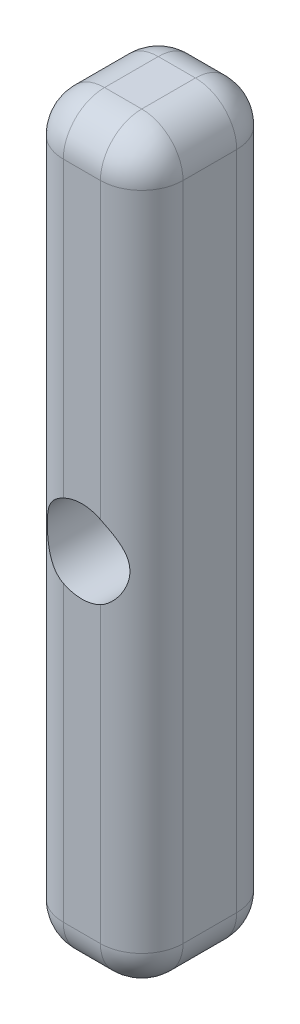
ISO-10303-21;
HEADER;
FILE_DESCRIPTION(('STEP AP214'),'2;1');
FILE_NAME('part.step','',(''),(''),'','','');
FILE_SCHEMA(('AUTOMOTIVE_DESIGN { 1 0 10303 214 1 1 1 1 }'));
ENDSEC;
DATA;
#1=APPLICATION_CONTEXT('core data for automotive mechanical design processes');
#2=APPLICATION_PROTOCOL_DEFINITION('international standard','automotive_design',2000,#1);
#3=PRODUCT_CONTEXT('',#1,'mechanical');
#4=PRODUCT('Part','Part','',(#3));
#5=PRODUCT_RELATED_PRODUCT_CATEGORY('part','',(#4));
#6=PRODUCT_DEFINITION_FORMATION('','',#4);
#7=PRODUCT_DEFINITION_CONTEXT('part definition',#1,'design');
#8=PRODUCT_DEFINITION('design','',#6,#7);
#9=PRODUCT_DEFINITION_SHAPE('','',#8);
#10=(LENGTH_UNIT() NAMED_UNIT(*) SI_UNIT(.MILLI.,.METRE.));
#11=(NAMED_UNIT(*) PLANE_ANGLE_UNIT() SI_UNIT($,.RADIAN.));
#12=(NAMED_UNIT(*) SI_UNIT($,.STERADIAN.) SOLID_ANGLE_UNIT());
#13=UNCERTAINTY_MEASURE_WITH_UNIT(LENGTH_MEASURE(1.E-05),#10,'distance_accuracy_value','');
#14=(GEOMETRIC_REPRESENTATION_CONTEXT(3) GLOBAL_UNCERTAINTY_ASSIGNED_CONTEXT((#13)) GLOBAL_UNIT_ASSIGNED_CONTEXT((#10,
#11,#12)) REPRESENTATION_CONTEXT('',''));
#15=CARTESIAN_POINT('',(0.,0.,0.));
#16=DIRECTION('',(0.,0.,1.));
#17=DIRECTION('',(1.,0.,0.));
#18=AXIS2_PLACEMENT_3D('',#15,#16,#17);
#19=CARTESIAN_POINT('',(0.,0.,16.5));
#20=DIRECTION('',(0.,0.,-1.));
#21=DIRECTION('',(-1.,0.,0.));
#22=AXIS2_PLACEMENT_3D('',#19,#20,#21);
#23=PLANE('',#22);
#24=DIRECTION('',(-1.,0.,0.));
#25=VECTOR('',#24,1.);
#26=CARTESIAN_POINT('',(0.,40.,16.5));
#27=LINE('',#26,#25);
#28=CARTESIAN_POINT('',(2.25,40.,16.5));
#29=VERTEX_POINT('',#28);
#30=CARTESIAN_POINT('',(-2.25,40.,16.5));
#31=VERTEX_POINT('',#30);
#32=EDGE_CURVE('E168',#29,#31,#27,.T.);
#33=ORIENTED_EDGE('',*,*,#32,.T.);
#34=DIRECTION('',(0.,-1.,0.));
#35=VECTOR('',#34,1.);
#36=CARTESIAN_POINT('',(-2.25,0.,16.5));
#37=LINE('',#36,#35);
#38=CARTESIAN_POINT('',(-2.25,4.46514277487294,16.5));
#39=VERTEX_POINT('',#38);
#40=EDGE_CURVE('E153',#31,#39,#37,.T.);
#41=ORIENTED_EDGE('',*,*,#40,.T.);
#42=CARTESIAN_POINT('',(0.,0.,16.5));
#43=DIRECTION('',(0.,0.,1.));
#44=DIRECTION('',(1.,0.,0.));
#45=AXIS2_PLACEMENT_3D('',#42,#43,#44);
#46=CIRCLE('',#45,5.);
#47=CARTESIAN_POINT('',(2.25,4.46514277487294,16.5));
#48=VERTEX_POINT('',#47);
#49=EDGE_CURVE('E144',#48,#39,#46,.T.);
#50=ORIENTED_EDGE('',*,*,#49,.F.);
#51=DIRECTION('',(0.,1.,0.));
#52=VECTOR('',#51,1.);
#53=CARTESIAN_POINT('',(2.25,0.,16.5));
#54=LINE('',#53,#52);
#55=EDGE_CURVE('E151',#48,#29,#54,.T.);
#56=ORIENTED_EDGE('',*,*,#55,.T.);
#57=EDGE_LOOP('',(#33,#41,#50,#56));
#58=FACE_BOUND('',#57,.T.);
#59=ADVANCED_FACE('F39',(#58),#23,.F.);
#60=CARTESIAN_POINT('',(7.25,45.,16.5));
#61=DIRECTION('',(0.,-1.,0.));
#62=DIRECTION('',(0.,0.,-1.));
#63=AXIS2_PLACEMENT_3D('',#60,#61,#62);
#64=PLANE('',#63);
#65=DIRECTION('',(-1.,0.,0.));
#66=VECTOR('',#65,1.);
#67=CARTESIAN_POINT('',(7.25,45.,11.5));
#68=LINE('',#67,#66);
#69=CARTESIAN_POINT('',(-2.25,45.,11.5));
#70=VERTEX_POINT('',#69);
#71=CARTESIAN_POINT('',(2.25,45.,11.5));
#72=VERTEX_POINT('',#71);
#73=EDGE_CURVE('E475',#70,#72,#68,.F.);
#74=ORIENTED_EDGE('',*,*,#73,.T.);
#75=DIRECTION('',(0.,0.,-1.));
#76=VECTOR('',#75,1.);
#77=CARTESIAN_POINT('',(2.25,45.,16.5));
#78=LINE('',#77,#76);
#79=CARTESIAN_POINT('',(2.25,45.,5.));
#80=VERTEX_POINT('',#79);
#81=EDGE_CURVE('E464',#72,#80,#78,.T.);
#82=ORIENTED_EDGE('',*,*,#81,.T.);
#83=DIRECTION('',(-1.,0.,0.));
#84=VECTOR('',#83,1.);
#85=CARTESIAN_POINT('',(-7.25,45.,5.));
#86=LINE('',#85,#84);
#87=CARTESIAN_POINT('',(-2.25,45.,5.));
#88=VERTEX_POINT('',#87);
#89=EDGE_CURVE('E469',#80,#88,#86,.T.);
#90=ORIENTED_EDGE('',*,*,#89,.T.);
#91=DIRECTION('',(0.,0.,-1.));
#92=VECTOR('',#91,1.);
#93=CARTESIAN_POINT('',(-2.25,45.,16.5));
#94=LINE('',#93,#92);
#95=EDGE_CURVE('E479',#88,#70,#94,.F.);
#96=ORIENTED_EDGE('',*,*,#95,.T.);
#97=EDGE_LOOP('',(#74,#82,#90,#96));
#98=FACE_BOUND('',#97,.T.);
#99=ADVANCED_FACE('F211',(#98),#64,.F.);
#100=CARTESIAN_POINT('',(-7.25,-45.,16.5));
#101=DIRECTION('',(1.,0.,0.));
#102=DIRECTION('',(0.,0.,-1.));
#103=AXIS2_PLACEMENT_3D('',#100,#101,#102);
#104=PLANE('',#103);
#105=DIRECTION('',(0.,0.,-1.));
#106=VECTOR('',#105,1.);
#107=CARTESIAN_POINT('',(-7.25,-40.,16.5));
#108=LINE('',#107,#106);
#109=CARTESIAN_POINT('',(-7.25,-40.,5.));
#110=VERTEX_POINT('',#109);
#111=CARTESIAN_POINT('',(-7.25,-40.,11.5));
#112=VERTEX_POINT('',#111);
#113=EDGE_CURVE('E581',#110,#112,#108,.F.);
#114=ORIENTED_EDGE('',*,*,#113,.T.);
#115=DIRECTION('',(0.,-1.,0.));
#116=VECTOR('',#115,1.);
#117=CARTESIAN_POINT('',(-7.25,-45.,11.5));
#118=LINE('',#117,#116);
#119=CARTESIAN_POINT('',(-7.25,40.,11.5));
#120=VERTEX_POINT('',#119);
#121=EDGE_CURVE('E565',#112,#120,#118,.F.);
#122=ORIENTED_EDGE('',*,*,#121,.T.);
#123=DIRECTION('',(0.,0.,-1.));
#124=VECTOR('',#123,1.);
#125=CARTESIAN_POINT('',(-7.25,40.,16.5));
#126=LINE('',#125,#124);
#127=CARTESIAN_POINT('',(-7.25,40.,5.));
#128=VERTEX_POINT('',#127);
#129=EDGE_CURVE('E564',#120,#128,#126,.T.);
#130=ORIENTED_EDGE('',*,*,#129,.T.);
#131=DIRECTION('',(0.,-1.,0.));
#132=VECTOR('',#131,1.);
#133=CARTESIAN_POINT('',(-7.25,-45.,5.));
#134=LINE('',#133,#132);
#135=EDGE_CURVE('E567',#128,#110,#134,.T.);
#136=ORIENTED_EDGE('',*,*,#135,.T.);
#137=EDGE_LOOP('',(#114,#122,#130,#136));
#138=FACE_BOUND('',#137,.T.);
#139=ADVANCED_FACE('F208',(#138),#104,.F.);
#140=CARTESIAN_POINT('',(7.25,-45.,16.5));
#141=DIRECTION('',(0.,1.,0.));
#142=DIRECTION('',(0.,0.,1.));
#143=AXIS2_PLACEMENT_3D('',#140,#141,#142);
#144=PLANE('',#143);
#145=DIRECTION('',(1.,0.,0.));
#146=VECTOR('',#145,1.);
#147=CARTESIAN_POINT('',(7.25,-45.,11.5));
#148=LINE('',#147,#146);
#149=CARTESIAN_POINT('',(2.25,-45.,11.5));
#150=VERTEX_POINT('',#149);
#151=CARTESIAN_POINT('',(-2.25,-45.,11.5));
#152=VERTEX_POINT('',#151);
#153=EDGE_CURVE('E48',#150,#152,#148,.F.);
#154=ORIENTED_EDGE('',*,*,#153,.T.);
#155=DIRECTION('',(0.,0.,-1.));
#156=VECTOR('',#155,1.);
#157=CARTESIAN_POINT('',(-2.25,-45.,16.5));
#158=LINE('',#157,#156);
#159=CARTESIAN_POINT('',(-2.25,-45.,5.));
#160=VERTEX_POINT('',#159);
#161=EDGE_CURVE('E11',#152,#160,#158,.T.);
#162=ORIENTED_EDGE('',*,*,#161,.T.);
#163=DIRECTION('',(1.,0.,0.));
#164=VECTOR('',#163,1.);
#165=CARTESIAN_POINT('',(7.25,-45.,5.));
#166=LINE('',#165,#164);
#167=CARTESIAN_POINT('',(2.25,-45.,5.));
#168=VERTEX_POINT('',#167);
#169=EDGE_CURVE('E487',#160,#168,#166,.T.);
#170=ORIENTED_EDGE('',*,*,#169,.T.);
#171=DIRECTION('',(0.,0.,-1.));
#172=VECTOR('',#171,1.);
#173=CARTESIAN_POINT('',(2.25,-45.,16.5));
#174=LINE('',#173,#172);
#175=EDGE_CURVE('E56',#168,#150,#174,.F.);
#176=ORIENTED_EDGE('',*,*,#175,.T.);
#177=EDGE_LOOP('',(#154,#162,#170,#176));
#178=FACE_BOUND('',#177,.T.);
#179=ADVANCED_FACE('F207',(#178),#144,.F.);
#180=CARTESIAN_POINT('',(7.25,-45.,16.5));
#181=DIRECTION('',(-1.,0.,0.));
#182=DIRECTION('',(0.,0.,1.));
#183=AXIS2_PLACEMENT_3D('',#180,#181,#182);
#184=PLANE('',#183);
#185=DIRECTION('',(0.,0.,-1.));
#186=VECTOR('',#185,1.);
#187=CARTESIAN_POINT('',(7.25,40.,16.5));
#188=LINE('',#187,#186);
#189=CARTESIAN_POINT('',(7.25,40.,5.));
#190=VERTEX_POINT('',#189);
#191=CARTESIAN_POINT('',(7.25,40.,11.5));
#192=VERTEX_POINT('',#191);
#193=EDGE_CURVE('E465',#190,#192,#188,.F.);
#194=ORIENTED_EDGE('',*,*,#193,.T.);
#195=DIRECTION('',(0.,1.,0.));
#196=VECTOR('',#195,1.);
#197=CARTESIAN_POINT('',(7.25,-45.,11.5));
#198=LINE('',#197,#196);
#199=CARTESIAN_POINT('',(7.25,-40.,11.5));
#200=VERTEX_POINT('',#199);
#201=EDGE_CURVE('E574',#192,#200,#198,.F.);
#202=ORIENTED_EDGE('',*,*,#201,.T.);
#203=DIRECTION('',(0.,0.,-1.));
#204=VECTOR('',#203,1.);
#205=CARTESIAN_POINT('',(7.25,-40.,16.5));
#206=LINE('',#205,#204);
#207=CARTESIAN_POINT('',(7.25,-40.,5.));
#208=VERTEX_POINT('',#207);
#209=EDGE_CURVE('E562',#200,#208,#206,.T.);
#210=ORIENTED_EDGE('',*,*,#209,.T.);
#211=DIRECTION('',(0.,1.,0.));
#212=VECTOR('',#211,1.);
#213=CARTESIAN_POINT('',(7.25,45.,5.));
#214=LINE('',#213,#212);
#215=EDGE_CURVE('E570',#208,#190,#214,.T.);
#216=ORIENTED_EDGE('',*,*,#215,.T.);
#217=EDGE_LOOP('',(#194,#202,#210,#216));
#218=FACE_BOUND('',#217,.T.);
#219=ADVANCED_FACE('F200',(#218),#184,.F.);
#220=CARTESIAN_POINT('',(-2.25,-4.46514277487294,16.5));
#221=VERTEX_POINT('',#220);
#222=CARTESIAN_POINT('',(2.25,-4.46514277487294,16.5));
#223=VERTEX_POINT('',#222);
#224=EDGE_CURVE('E148',#221,#223,#46,.T.);
#225=ORIENTED_EDGE('',*,*,#224,.F.);
#226=DIRECTION('',(0.,-1.,0.));
#227=VECTOR('',#226,1.);
#228=CARTESIAN_POINT('',(-2.25,0.,16.5));
#229=LINE('',#228,#227);
#230=CARTESIAN_POINT('',(-2.25,-40.,16.5));
#231=VERTEX_POINT('',#230);
#232=EDGE_CURVE('E169',#221,#231,#229,.T.);
#233=ORIENTED_EDGE('',*,*,#232,.T.);
#234=DIRECTION('',(1.,0.,0.));
#235=VECTOR('',#234,1.);
#236=CARTESIAN_POINT('',(0.,-40.,16.5));
#237=LINE('',#236,#235);
#238=CARTESIAN_POINT('',(2.25,-40.,16.5));
#239=VERTEX_POINT('',#238);
#240=EDGE_CURVE('E553',#231,#239,#237,.T.);
#241=ORIENTED_EDGE('',*,*,#240,.T.);
#242=DIRECTION('',(0.,1.,0.));
#243=VECTOR('',#242,1.);
#244=CARTESIAN_POINT('',(2.25,0.,16.5));
#245=LINE('',#244,#243);
#246=EDGE_CURVE('E551',#239,#223,#245,.T.);
#247=ORIENTED_EDGE('',*,*,#246,.T.);
#248=EDGE_LOOP('',(#225,#233,#241,#247));
#249=FACE_BOUND('',#248,.T.);
#250=ADVANCED_FACE('F192',(#249),#23,.F.);
#251=CARTESIAN_POINT('',(0.,0.,0.));
#252=DIRECTION('',(0.,0.,-1.));
#253=DIRECTION('',(-1.,0.,0.));
#254=AXIS2_PLACEMENT_3D('',#251,#252,#253);
#255=PLANE('',#254);
#256=DIRECTION('',(0.,-1.,0.));
#257=VECTOR('',#256,1.);
#258=CARTESIAN_POINT('',(-2.25,45.,0.));
#259=LINE('',#258,#257);
#260=CARTESIAN_POINT('',(-2.25,-40.,0.));
#261=VERTEX_POINT('',#260);
#262=CARTESIAN_POINT('',(-2.25,40.,0.));
#263=VERTEX_POINT('',#262);
#264=EDGE_CURVE('E481',#261,#263,#259,.F.);
#265=ORIENTED_EDGE('',*,*,#264,.T.);
#266=DIRECTION('',(-1.,0.,0.));
#267=VECTOR('',#266,1.);
#268=CARTESIAN_POINT('',(7.25,40.,0.));
#269=LINE('',#268,#267);
#270=CARTESIAN_POINT('',(2.25,40.,0.));
#271=VERTEX_POINT('',#270);
#272=EDGE_CURVE('E482',#263,#271,#269,.F.);
#273=ORIENTED_EDGE('',*,*,#272,.T.);
#274=DIRECTION('',(0.,1.,0.));
#275=VECTOR('',#274,1.);
#276=CARTESIAN_POINT('',(2.25,-45.,0.));
#277=LINE('',#276,#275);
#278=CARTESIAN_POINT('',(2.25,-40.,0.));
#279=VERTEX_POINT('',#278);
#280=EDGE_CURVE('E472',#271,#279,#277,.F.);
#281=ORIENTED_EDGE('',*,*,#280,.T.);
#282=DIRECTION('',(1.,0.,0.));
#283=VECTOR('',#282,1.);
#284=CARTESIAN_POINT('',(-7.25,-40.,0.));
#285=LINE('',#284,#283);
#286=EDGE_CURVE('E471',#279,#261,#285,.F.);
#287=ORIENTED_EDGE('',*,*,#286,.T.);
#288=EDGE_LOOP('',(#265,#273,#281,#287));
#289=FACE_BOUND('',#288,.T.);
#290=ADVANCED_FACE('F191',(#289),#255,.T.);
#291=CARTESIAN_POINT('',(0.,0.,3.5));
#292=DIRECTION('',(0.,0.,1.));
#293=DIRECTION('',(1.,0.,0.));
#294=AXIS2_PLACEMENT_3D('',#291,#292,#293);
#295=CYLINDRICAL_SURFACE('',#294,5.);
#296=CARTESIAN_POINT('',(0.,0.,3.5));
#297=DIRECTION('',(0.,0.,1.));
#298=DIRECTION('',(1.,0.,0.));
#299=AXIS2_PLACEMENT_3D('',#296,#297,#298);
#300=CIRCLE('',#299,5.);
#301=CARTESIAN_POINT('',(5.,0.,3.5));
#302=VERTEX_POINT('',#301);
#303=EDGE_CURVE('E160',#302,#302,#300,.T.);
#304=ORIENTED_EDGE('',*,*,#303,.F.);
#305=EDGE_LOOP('',(#304));
#306=FACE_BOUND('',#305,.T.);
#307=ORIENTED_EDGE('',*,*,#49,.T.);
#308=CARTESIAN_POINT('',(-2.25,4.46514277487294,16.5));
#309=CARTESIAN_POINT('',(-2.36763941872739,4.40589367413245,16.5000177384845));
#310=CARTESIAN_POINT('',(-2.48283993615807,4.34198705837842,16.4958498174685));
#311=CARTESIAN_POINT('',(-2.70735869866159,4.20563473719382,16.4803030490482));
#312=CARTESIAN_POINT('',(-2.81668476345617,4.13320081461912,16.4689340588938));
#313=CARTESIAN_POINT('',(-3.02798431943095,3.98097468015155,16.4402468084663));
#314=CARTESIAN_POINT('',(-3.13000661626239,3.90124145061437,16.4229736048319));
#315=CARTESIAN_POINT('',(-3.32704485390078,3.73462695600149,16.3836542331769));
#316=CARTESIAN_POINT('',(-3.42205843548182,3.64774330463296,16.3616064677161));
#317=CARTESIAN_POINT('',(-3.6950124252242,3.37816117935055,16.2903152817992));
#318=CARTESIAN_POINT('',(-3.86210456571715,3.18563252763685,16.2357295082399));
#319=CARTESIAN_POINT('',(-4.08903804569647,2.88027135370775,16.1502188448062));
#320=CARTESIAN_POINT('',(-4.16083895642888,2.77552039277155,16.1210544515042));
#321=CARTESIAN_POINT('',(-4.29628103992035,2.56087552295242,16.0626921332652));
#322=CARTESIAN_POINT('',(-4.35992131544122,2.45098105036531,16.0334942049966));
#323=CARTESIAN_POINT('',(-4.55236536052825,2.0872694917997,15.9408263310664));
#324=CARTESIAN_POINT('',(-4.66443206981224,1.82352723195792,15.8796248246105));
#325=CARTESIAN_POINT('',(-4.79787710889541,1.41455787708638,15.8024349260961));
#326=CARTESIAN_POINT('',(-4.83657259869927,1.27607897447896,15.7791480905268));
#327=CARTESIAN_POINT('',(-4.90203575830977,0.995375907910255,15.7388905619299));
#328=CARTESIAN_POINT('',(-4.92880546050864,0.853152386485573,15.7219187927703));
#329=CARTESIAN_POINT('',(-4.96855755755883,0.575938178987913,15.6964227982793));
#330=CARTESIAN_POINT('',(-4.98234959766289,0.441108426799793,15.6874051034966));
#331=CARTESIAN_POINT('',(-4.998930737032,0.17048202507457,15.6765392953172));
#332=CARTESIAN_POINT('',(-5.00172042267079,0.0346854274522222,15.6746907998359));
#333=CARTESIAN_POINT('',(-4.99624144962365,-0.23657252902098,15.6782976025404));
#334=CARTESIAN_POINT('',(-4.98797421103391,-0.372033928684486,15.683751962784));
#335=CARTESIAN_POINT('',(-4.96054611918783,-0.641348150377429,15.7015701078942));
#336=CARTESIAN_POINT('',(-4.94138550477139,-0.775201007608845,15.7139337412732));
#337=CARTESIAN_POINT('',(-4.87406631182834,-1.13975209695276,15.7563973897545));
#338=CARTESIAN_POINT('',(-4.81493706648146,-1.36777602929481,15.7928450217821));
#339=CARTESIAN_POINT('',(-4.66631741485742,-1.81118825752496,15.8782047193024));
#340=CARTESIAN_POINT('',(-4.57679342322397,-2.02656226546175,15.9271305579259));
#341=CARTESIAN_POINT('',(-4.35520888133217,-2.47013683538152,16.0371091090358));
#342=CARTESIAN_POINT('',(-4.2190276231344,-2.69611936201107,16.0989066796638));
#343=CARTESIAN_POINT('',(-3.98927039210632,-3.01712430406534,16.1884647765408));
#344=CARTESIAN_POINT('',(-3.90847454552075,-3.12109309607515,16.2177833175709));
#345=CARTESIAN_POINT('',(-3.73856037456244,-3.32273006485733,16.2741169775141));
#346=CARTESIAN_POINT('',(-3.64944154929259,-3.42039786182164,16.3011319576059));
#347=CARTESIAN_POINT('',(-3.46260841511011,-3.60944894133504,16.3517015841764));
#348=CARTESIAN_POINT('',(-3.36484125740312,-3.70078649104852,16.3752322153626));
#349=CARTESIAN_POINT('',(-3.16169099966968,-3.87578111559663,16.4172734402199));
#350=CARTESIAN_POINT('',(-3.05631064514129,-3.95944093473587,16.435785832254));
#351=CARTESIAN_POINT('',(-2.83777883657689,-4.11890726055911,16.4665631196433));
#352=CARTESIAN_POINT('',(-2.72458057950156,-4.19465814486983,16.4787858691114));
#353=CARTESIAN_POINT('',(-2.49180690105894,-4.33700652022862,16.4955205831415));
#354=CARTESIAN_POINT('',(-2.37222214485026,-4.40359007377898,16.5000209234937));
#355=CARTESIAN_POINT('',(-2.25,-4.46514277487294,16.5));
#356=B_SPLINE_CURVE_WITH_KNOTS('',3,(#308,#309,#310,#311,#312,#313,#314,#315,#316,#317,#318,
#319,#320,#321,#322,#323,#324,#325,#326,#327,#328,#329,#330,#331,#332,#333,#334,#335,#336,#337,
#338,#339,#340,#341,#342,#343,#344,#345,#346,#347,#348,#349,#350,#351,#352,#353,#354,#355),
.UNSPECIFIED.,.F.,.F.,(4,2,2,2,2,2,2,2,2,2,2,2,2,2,2,2,2,2,2,2,2,2,2,4),(0.,0.394860119699031,
0.789180896162676,1.18055730848954,1.57206486771689,2.35050524654637,2.74112706009149,
3.13179178461606,4.0055560167331,4.4420160827286,4.87840173873699,5.28528968182163,
5.69215593939967,6.0989699461234,6.50577503369584,7.21774693604771,7.93050812203701,
8.73987525162162,9.14423505054802,9.5486192005323,9.95567231961067,10.3625793715252,
10.7721786542793,11.1823939501022),.UNSPECIFIED.);
#357=EDGE_CURVE('E147',#39,#221,#356,.T.);
#358=ORIENTED_EDGE('',*,*,#357,.T.);
#359=ORIENTED_EDGE('',*,*,#224,.T.);
#360=CARTESIAN_POINT('',(2.25,-4.46514277487294,16.5));
#361=CARTESIAN_POINT('',(2.36763941872738,-4.40589367413245,16.5000177384845));
#362=CARTESIAN_POINT('',(2.48283993615807,-4.34198705837842,16.4958498174685));
#363=CARTESIAN_POINT('',(2.70735869866159,-4.20563473719382,16.4803030490482));
#364=CARTESIAN_POINT('',(2.81668476345617,-4.13320081461912,16.4689340588938));
#365=CARTESIAN_POINT('',(3.02798431943095,-3.98097468015155,16.4402468084663));
#366=CARTESIAN_POINT('',(3.13000661626239,-3.90124145061437,16.4229736048319));
#367=CARTESIAN_POINT('',(3.32704485390078,-3.73462695600149,16.3836542331769));
#368=CARTESIAN_POINT('',(3.42205843548181,-3.64774330463296,16.3616064677161));
#369=CARTESIAN_POINT('',(3.6950124252242,-3.37816117935055,16.2903152817992));
#370=CARTESIAN_POINT('',(3.86210456571715,-3.18563252763685,16.2357295082398));
#371=CARTESIAN_POINT('',(4.08903804569647,-2.88027135370775,16.1502188448062));
#372=CARTESIAN_POINT('',(4.16083895642888,-2.77552039277155,16.1210544515042));
#373=CARTESIAN_POINT('',(4.29628103992035,-2.56087552295242,16.0626921332652));
#374=CARTESIAN_POINT('',(4.35992131544122,-2.45098105036531,16.0334942049966));
#375=CARTESIAN_POINT('',(4.55236536052825,-2.0872694917997,15.9408263310664));
#376=CARTESIAN_POINT('',(4.66443206981224,-1.82352723195792,15.8796248246105));
#377=CARTESIAN_POINT('',(4.79787710889541,-1.41455787708638,15.8024349260961));
#378=CARTESIAN_POINT('',(4.83657259869927,-1.27607897447896,15.7791480905268));
#379=CARTESIAN_POINT('',(4.90203575830977,-0.995375907910258,15.7388905619299));
#380=CARTESIAN_POINT('',(4.92880546050864,-0.853152386485577,15.7219187927703));
#381=CARTESIAN_POINT('',(4.96855755755883,-0.575938178987916,15.6964227982793));
#382=CARTESIAN_POINT('',(4.98234959766289,-0.441108426799797,15.6874051034966));
#383=CARTESIAN_POINT('',(4.998930737032,-0.170482025074573,15.6765392953172));
#384=CARTESIAN_POINT('',(5.00172042267079,-0.0346854274522255,15.6746907998359));
#385=CARTESIAN_POINT('',(4.99624144962365,0.236572529020977,15.6782976025404));
#386=CARTESIAN_POINT('',(4.98797421103391,0.372033928684484,15.683751962784));
#387=CARTESIAN_POINT('',(4.96054611918783,0.641348150377426,15.7015701078942));
#388=CARTESIAN_POINT('',(4.94138550477139,0.775201007608842,15.7139337412732));
#389=CARTESIAN_POINT('',(4.87406631182834,1.13975209695276,15.7563973897545));
#390=CARTESIAN_POINT('',(4.81493706648146,1.36777602929481,15.7928450217821));
#391=CARTESIAN_POINT('',(4.66631741485743,1.81118825752496,15.8782047193024));
#392=CARTESIAN_POINT('',(4.57679342322397,2.02656226546175,15.9271305579259));
#393=CARTESIAN_POINT('',(4.35520888133217,2.47013683538151,16.0371091090358));
#394=CARTESIAN_POINT('',(4.2190276231344,2.69611936201107,16.0989066796638));
#395=CARTESIAN_POINT('',(3.98927039210632,3.01712430406534,16.1884647765408));
#396=CARTESIAN_POINT('',(3.90847454552075,3.12109309607515,16.2177833175709));
#397=CARTESIAN_POINT('',(3.73856037456244,3.32273006485733,16.2741169775141));
#398=CARTESIAN_POINT('',(3.64944154929259,3.42039786182164,16.3011319576059));
#399=CARTESIAN_POINT('',(3.46260841511012,3.60944894133504,16.3517015841764));
#400=CARTESIAN_POINT('',(3.36484125740312,3.70078649104852,16.3752322153626));
#401=CARTESIAN_POINT('',(3.16169099966969,3.87578111559663,16.4172734402199));
#402=CARTESIAN_POINT('',(3.05631064514129,3.95944093473586,16.435785832254));
#403=CARTESIAN_POINT('',(2.83777883657689,4.11890726055911,16.4665631196433));
#404=CARTESIAN_POINT('',(2.72458057950156,4.19465814486983,16.4787858691114));
#405=CARTESIAN_POINT('',(2.49180690105894,4.33700652022862,16.4955205831415));
#406=CARTESIAN_POINT('',(2.37222214485026,4.40359007377898,16.5000209234937));
#407=CARTESIAN_POINT('',(2.25,4.46514277487294,16.5));
#408=B_SPLINE_CURVE_WITH_KNOTS('',3,(#360,#361,#362,#363,#364,#365,#366,#367,#368,#369,#370,
#371,#372,#373,#374,#375,#376,#377,#378,#379,#380,#381,#382,#383,#384,#385,#386,#387,#388,#389,
#390,#391,#392,#393,#394,#395,#396,#397,#398,#399,#400,#401,#402,#403,#404,#405,#406,#407),
.UNSPECIFIED.,.F.,.F.,(4,2,2,2,2,2,2,2,2,2,2,2,2,2,2,2,2,2,2,2,2,2,2,4),(0.,0.394860119699031,
0.789180896162676,1.18055730848954,1.57206486771689,2.35050524654637,2.74112706009149,
3.13179178461606,4.0055560167331,4.4420160827286,4.87840173873699,5.28528968182163,
5.69215593939966,6.0989699461234,6.50577503369584,7.21774693604771,7.93050812203701,
8.73987525162162,9.14423505054802,9.5486192005323,9.95567231961067,10.3625793715252,
10.7721786542793,11.1823939501022),.UNSPECIFIED.);
#409=EDGE_CURVE('E142',#223,#48,#408,.T.);
#410=ORIENTED_EDGE('',*,*,#409,.T.);
#411=EDGE_LOOP('',(#307,#358,#359,#410));
#412=FACE_BOUND('',#411,.T.);
#413=ADVANCED_FACE('F141',(#306,#412),#295,.F.);
#414=CARTESIAN_POINT('',(0.,0.,3.5));
#415=DIRECTION('',(0.,0.,1.));
#416=DIRECTION('',(1.,0.,0.));
#417=AXIS2_PLACEMENT_3D('',#414,#415,#416);
#418=PLANE('',#417);
#419=ORIENTED_EDGE('',*,*,#303,.T.);
#420=EDGE_LOOP('',(#419));
#421=FACE_BOUND('',#420,.T.);
#422=ADVANCED_FACE('F195',(#421),#418,.T.);
#423=CARTESIAN_POINT('',(2.25,-45.,5.));
#424=DIRECTION('',(0.,-1.,0.));
#425=DIRECTION('',(0.,0.,-1.));
#426=AXIS2_PLACEMENT_3D('',#423,#424,#425);
#427=CYLINDRICAL_SURFACE('',#426,5.);
#428=CARTESIAN_POINT('',(2.25,40.,5.));
#429=DIRECTION('',(0.,1.,0.));
#430=DIRECTION('',(0.,0.,1.));
#431=AXIS2_PLACEMENT_3D('',#428,#429,#430);
#432=CIRCLE('',#431,5.);
#433=EDGE_CURVE('E43',#190,#271,#432,.T.);
#434=ORIENTED_EDGE('',*,*,#433,.F.);
#435=ORIENTED_EDGE('',*,*,#215,.F.);
#436=CARTESIAN_POINT('',(2.25,-40.,5.));
#437=DIRECTION('',(0.,-1.,0.));
#438=DIRECTION('',(0.,0.,-1.));
#439=AXIS2_PLACEMENT_3D('',#436,#437,#438);
#440=CIRCLE('',#439,5.);
#441=EDGE_CURVE('E542',#279,#208,#440,.T.);
#442=ORIENTED_EDGE('',*,*,#441,.F.);
#443=ORIENTED_EDGE('',*,*,#280,.F.);
#444=EDGE_LOOP('',(#434,#435,#442,#443));
#445=FACE_BOUND('',#444,.T.);
#446=ADVANCED_FACE('F41',(#445),#427,.T.);
#447=CARTESIAN_POINT('',(2.25,40.,5.));
#448=DIRECTION('',(0.,0.,-1.));
#449=DIRECTION('',(-1.,0.,0.));
#450=AXIS2_PLACEMENT_3D('',#447,#448,#449);
#451=SPHERICAL_SURFACE('',#450,5.);
#452=CARTESIAN_POINT('',(2.25,40.,5.));
#453=DIRECTION('',(0.,0.,-1.));
#454=DIRECTION('',(-1.,0.,0.));
#455=AXIS2_PLACEMENT_3D('',#452,#453,#454);
#456=CIRCLE('',#455,5.);
#457=EDGE_CURVE('E457',#190,#80,#456,.F.);
#458=ORIENTED_EDGE('',*,*,#457,.F.);
#459=ORIENTED_EDGE('',*,*,#433,.T.);
#460=CARTESIAN_POINT('',(2.25,40.,5.));
#461=DIRECTION('',(1.,0.,0.));
#462=DIRECTION('',(0.,0.,-1.));
#463=AXIS2_PLACEMENT_3D('',#460,#461,#462);
#464=CIRCLE('',#463,5.);
#465=EDGE_CURVE('E467',#80,#271,#464,.F.);
#466=ORIENTED_EDGE('',*,*,#465,.F.);
#467=EDGE_LOOP('',(#458,#459,#466));
#468=FACE_BOUND('',#467,.T.);
#469=ADVANCED_FACE('F328',(#468),#451,.T.);
#470=CARTESIAN_POINT('',(2.25,-40.,5.));
#471=DIRECTION('',(1.,0.,0.));
#472=DIRECTION('',(0.,0.,-1.));
#473=AXIS2_PLACEMENT_3D('',#470,#471,#472);
#474=SPHERICAL_SURFACE('',#473,5.);
#475=CARTESIAN_POINT('',(2.25,-40.,5.));
#476=DIRECTION('',(1.,0.,0.));
#477=DIRECTION('',(0.,0.,-1.));
#478=AXIS2_PLACEMENT_3D('',#475,#476,#477);
#479=CIRCLE('',#478,5.);
#480=EDGE_CURVE('E536',#279,#168,#479,.F.);
#481=ORIENTED_EDGE('',*,*,#480,.F.);
#482=ORIENTED_EDGE('',*,*,#441,.T.);
#483=CARTESIAN_POINT('',(2.25,-40.,5.));
#484=DIRECTION('',(0.,0.,-1.));
#485=DIRECTION('',(-1.,0.,0.));
#486=AXIS2_PLACEMENT_3D('',#483,#484,#485);
#487=CIRCLE('',#486,5.);
#488=EDGE_CURVE('E470',#168,#208,#487,.F.);
#489=ORIENTED_EDGE('',*,*,#488,.F.);
#490=EDGE_LOOP('',(#481,#482,#489));
#491=FACE_BOUND('',#490,.T.);
#492=ADVANCED_FACE('F335',(#491),#474,.T.);
#493=CARTESIAN_POINT('',(7.25,40.,5.));
#494=DIRECTION('',(1.,0.,0.));
#495=DIRECTION('',(0.,0.,-1.));
#496=AXIS2_PLACEMENT_3D('',#493,#494,#495);
#497=CYLINDRICAL_SURFACE('',#496,5.);
#498=ORIENTED_EDGE('',*,*,#465,.T.);
#499=ORIENTED_EDGE('',*,*,#272,.F.);
#500=CARTESIAN_POINT('',(-2.25,40.,5.));
#501=DIRECTION('',(-1.,0.,0.));
#502=DIRECTION('',(0.,0.,1.));
#503=AXIS2_PLACEMENT_3D('',#500,#501,#502);
#504=CIRCLE('',#503,5.);
#505=EDGE_CURVE('E531',#88,#263,#504,.T.);
#506=ORIENTED_EDGE('',*,*,#505,.F.);
#507=ORIENTED_EDGE('',*,*,#89,.F.);
#508=EDGE_LOOP('',(#498,#499,#506,#507));
#509=FACE_BOUND('',#508,.T.);
#510=ADVANCED_FACE('F343',(#509),#497,.T.);
#511=CARTESIAN_POINT('',(2.25,40.,16.5));
#512=DIRECTION('',(0.,0.,-1.));
#513=DIRECTION('',(-1.,0.,0.));
#514=AXIS2_PLACEMENT_3D('',#511,#512,#513);
#515=CYLINDRICAL_SURFACE('',#514,5.);
#516=ORIENTED_EDGE('',*,*,#457,.T.);
#517=ORIENTED_EDGE('',*,*,#81,.F.);
#518=CARTESIAN_POINT('',(2.25,40.,11.5));
#519=DIRECTION('',(0.,0.,1.));
#520=DIRECTION('',(1.,0.,0.));
#521=AXIS2_PLACEMENT_3D('',#518,#519,#520);
#522=CIRCLE('',#521,5.);
#523=EDGE_CURVE('E532',#192,#72,#522,.T.);
#524=ORIENTED_EDGE('',*,*,#523,.F.);
#525=ORIENTED_EDGE('',*,*,#193,.F.);
#526=EDGE_LOOP('',(#516,#517,#524,#525));
#527=FACE_BOUND('',#526,.T.);
#528=ADVANCED_FACE('F273',(#527),#515,.T.);
#529=CARTESIAN_POINT('',(2.25,0.,11.5));
#530=DIRECTION('',(0.,1.,0.));
#531=DIRECTION('',(0.,0.,1.));
#532=AXIS2_PLACEMENT_3D('',#529,#530,#531);
#533=CYLINDRICAL_SURFACE('',#532,5.);
#534=CARTESIAN_POINT('',(2.25,-40.,11.5));
#535=DIRECTION('',(0.,-1.,0.));
#536=DIRECTION('',(0.,0.,-1.));
#537=AXIS2_PLACEMENT_3D('',#534,#535,#536);
#538=CIRCLE('',#537,5.);
#539=EDGE_CURVE('E526',#200,#239,#538,.T.);
#540=ORIENTED_EDGE('',*,*,#539,.F.);
#541=ORIENTED_EDGE('',*,*,#201,.F.);
#542=CARTESIAN_POINT('',(2.25,40.,11.5));
#543=DIRECTION('',(0.,1.,0.));
#544=DIRECTION('',(0.,0.,1.));
#545=AXIS2_PLACEMENT_3D('',#542,#543,#544);
#546=CIRCLE('',#545,5.);
#547=EDGE_CURVE('E165',#29,#192,#546,.T.);
#548=ORIENTED_EDGE('',*,*,#547,.F.);
#549=ORIENTED_EDGE('',*,*,#55,.F.);
#550=ORIENTED_EDGE('',*,*,#409,.F.);
#551=ORIENTED_EDGE('',*,*,#246,.F.);
#552=EDGE_LOOP('',(#540,#541,#548,#549,#550,#551));
#553=FACE_BOUND('',#552,.T.);
#554=ADVANCED_FACE('F163',(#553),#533,.T.);
#555=CARTESIAN_POINT('',(2.25,-40.,16.5));
#556=DIRECTION('',(0.,0.,-1.));
#557=DIRECTION('',(-1.,0.,0.));
#558=AXIS2_PLACEMENT_3D('',#555,#556,#557);
#559=CYLINDRICAL_SURFACE('',#558,5.);
#560=ORIENTED_EDGE('',*,*,#488,.T.);
#561=ORIENTED_EDGE('',*,*,#209,.F.);
#562=CARTESIAN_POINT('',(2.25,-40.,11.5));
#563=DIRECTION('',(0.,0.,1.));
#564=DIRECTION('',(1.,0.,0.));
#565=AXIS2_PLACEMENT_3D('',#562,#563,#564);
#566=CIRCLE('',#565,5.);
#567=EDGE_CURVE('E521',#150,#200,#566,.T.);
#568=ORIENTED_EDGE('',*,*,#567,.F.);
#569=ORIENTED_EDGE('',*,*,#175,.F.);
#570=EDGE_LOOP('',(#560,#561,#568,#569));
#571=FACE_BOUND('',#570,.T.);
#572=ADVANCED_FACE('F270',(#571),#559,.T.);
#573=CARTESIAN_POINT('',(7.25,-40.,5.));
#574=DIRECTION('',(-1.,0.,0.));
#575=DIRECTION('',(0.,0.,1.));
#576=AXIS2_PLACEMENT_3D('',#573,#574,#575);
#577=CYLINDRICAL_SURFACE('',#576,5.);
#578=ORIENTED_EDGE('',*,*,#480,.T.);
#579=ORIENTED_EDGE('',*,*,#169,.F.);
#580=CARTESIAN_POINT('',(-2.25,-40.,5.));
#581=DIRECTION('',(-1.,0.,0.));
#582=DIRECTION('',(0.,-1.,0.));
#583=AXIS2_PLACEMENT_3D('',#580,#581,#582);
#584=CIRCLE('',#583,5.);
#585=EDGE_CURVE('E524',#261,#160,#584,.T.);
#586=ORIENTED_EDGE('',*,*,#585,.F.);
#587=ORIENTED_EDGE('',*,*,#286,.F.);
#588=EDGE_LOOP('',(#578,#579,#586,#587));
#589=FACE_BOUND('',#588,.T.);
#590=ADVANCED_FACE('F261',(#589),#577,.T.);
#591=CARTESIAN_POINT('',(-2.25,-45.,5.));
#592=DIRECTION('',(0.,1.,0.));
#593=DIRECTION('',(0.,0.,1.));
#594=AXIS2_PLACEMENT_3D('',#591,#592,#593);
#595=CYLINDRICAL_SURFACE('',#594,5.);
#596=CARTESIAN_POINT('',(-2.25,40.,5.));
#597=DIRECTION('',(0.,1.,0.));
#598=DIRECTION('',(-1.,0.,0.));
#599=AXIS2_PLACEMENT_3D('',#596,#597,#598);
#600=CIRCLE('',#599,5.);
#601=EDGE_CURVE('E533',#263,#128,#600,.T.);
#602=ORIENTED_EDGE('',*,*,#601,.F.);
#603=ORIENTED_EDGE('',*,*,#264,.F.);
#604=CARTESIAN_POINT('',(-2.25,-40.,5.));
#605=DIRECTION('',(0.,-1.,0.));
#606=DIRECTION('',(0.,0.,-1.));
#607=AXIS2_PLACEMENT_3D('',#604,#605,#606);
#608=CIRCLE('',#607,5.);
#609=EDGE_CURVE('E519',#110,#261,#608,.T.);
#610=ORIENTED_EDGE('',*,*,#609,.F.);
#611=ORIENTED_EDGE('',*,*,#135,.F.);
#612=EDGE_LOOP('',(#602,#603,#610,#611));
#613=FACE_BOUND('',#612,.T.);
#614=ADVANCED_FACE('F263',(#613),#595,.T.);
#615=CARTESIAN_POINT('',(-2.25,40.,5.));
#616=DIRECTION('',(0.,0.,-1.));
#617=DIRECTION('',(-1.,0.,0.));
#618=AXIS2_PLACEMENT_3D('',#615,#616,#617);
#619=SPHERICAL_SURFACE('',#618,5.);
#620=ORIENTED_EDGE('',*,*,#505,.T.);
#621=ORIENTED_EDGE('',*,*,#601,.T.);
#622=CARTESIAN_POINT('',(-2.25,40.,5.));
#623=DIRECTION('',(0.,0.,-1.));
#624=DIRECTION('',(-1.,0.,0.));
#625=AXIS2_PLACEMENT_3D('',#622,#623,#624);
#626=CIRCLE('',#625,5.);
#627=EDGE_CURVE('E518',#88,#128,#626,.F.);
#628=ORIENTED_EDGE('',*,*,#627,.F.);
#629=EDGE_LOOP('',(#620,#621,#628));
#630=FACE_BOUND('',#629,.T.);
#631=ADVANCED_FACE('F260',(#630),#619,.T.);
#632=CARTESIAN_POINT('',(2.25,40.,11.5));
#633=DIRECTION('',(1.,0.,0.));
#634=DIRECTION('',(0.,0.,-1.));
#635=AXIS2_PLACEMENT_3D('',#632,#633,#634);
#636=SPHERICAL_SURFACE('',#635,5.);
#637=ORIENTED_EDGE('',*,*,#547,.T.);
#638=ORIENTED_EDGE('',*,*,#523,.T.);
#639=CARTESIAN_POINT('',(2.25,40.,11.5));
#640=DIRECTION('',(1.,0.,0.));
#641=DIRECTION('',(0.,0.,-1.));
#642=AXIS2_PLACEMENT_3D('',#639,#640,#641);
#643=CIRCLE('',#642,5.);
#644=EDGE_CURVE('E514',#29,#72,#643,.F.);
#645=ORIENTED_EDGE('',*,*,#644,.F.);
#646=EDGE_LOOP('',(#637,#638,#645));
#647=FACE_BOUND('',#646,.T.);
#648=ADVANCED_FACE('F254',(#647),#636,.T.);
#649=CARTESIAN_POINT('',(2.25,-40.,11.5));
#650=DIRECTION('',(1.,0.,0.));
#651=DIRECTION('',(0.,0.,-1.));
#652=AXIS2_PLACEMENT_3D('',#649,#650,#651);
#653=SPHERICAL_SURFACE('',#652,5.);
#654=ORIENTED_EDGE('',*,*,#567,.T.);
#655=ORIENTED_EDGE('',*,*,#539,.T.);
#656=CARTESIAN_POINT('',(2.25,-40.,11.5));
#657=DIRECTION('',(1.,0.,0.));
#658=DIRECTION('',(0.,0.,-1.));
#659=AXIS2_PLACEMENT_3D('',#656,#657,#658);
#660=CIRCLE('',#659,5.);
#661=EDGE_CURVE('E509',#150,#239,#660,.F.);
#662=ORIENTED_EDGE('',*,*,#661,.F.);
#663=EDGE_LOOP('',(#654,#655,#662));
#664=FACE_BOUND('',#663,.T.);
#665=ADVANCED_FACE('F248',(#664),#653,.T.);
#666=CARTESIAN_POINT('',(-2.25,-40.,5.));
#667=DIRECTION('',(0.,0.,-1.));
#668=DIRECTION('',(-1.,0.,0.));
#669=AXIS2_PLACEMENT_3D('',#666,#667,#668);
#670=SPHERICAL_SURFACE('',#669,5.);
#671=ORIENTED_EDGE('',*,*,#609,.T.);
#672=ORIENTED_EDGE('',*,*,#585,.T.);
#673=CARTESIAN_POINT('',(-2.25,-40.,5.));
#674=DIRECTION('',(0.,0.,-1.));
#675=DIRECTION('',(-1.,0.,0.));
#676=AXIS2_PLACEMENT_3D('',#673,#674,#675);
#677=CIRCLE('',#676,5.);
#678=EDGE_CURVE('E507',#110,#160,#677,.F.);
#679=ORIENTED_EDGE('',*,*,#678,.F.);
#680=EDGE_LOOP('',(#671,#672,#679));
#681=FACE_BOUND('',#680,.T.);
#682=ADVANCED_FACE('F244',(#681),#670,.T.);
#683=CARTESIAN_POINT('',(-2.25,40.,16.5));
#684=DIRECTION('',(0.,0.,-1.));
#685=DIRECTION('',(-1.,0.,0.));
#686=AXIS2_PLACEMENT_3D('',#683,#684,#685);
#687=CYLINDRICAL_SURFACE('',#686,5.);
#688=ORIENTED_EDGE('',*,*,#627,.T.);
#689=ORIENTED_EDGE('',*,*,#129,.F.);
#690=CARTESIAN_POINT('',(-2.25,40.,11.5));
#691=DIRECTION('',(0.,0.,1.));
#692=DIRECTION('',(1.,0.,0.));
#693=AXIS2_PLACEMENT_3D('',#690,#691,#692);
#694=CIRCLE('',#693,5.);
#695=EDGE_CURVE('E504',#70,#120,#694,.T.);
#696=ORIENTED_EDGE('',*,*,#695,.F.);
#697=ORIENTED_EDGE('',*,*,#95,.F.);
#698=EDGE_LOOP('',(#688,#689,#696,#697));
#699=FACE_BOUND('',#698,.T.);
#700=ADVANCED_FACE('F241',(#699),#687,.T.);
#701=CARTESIAN_POINT('',(0.,40.,11.5));
#702=DIRECTION('',(-1.,0.,0.));
#703=DIRECTION('',(0.,0.,1.));
#704=AXIS2_PLACEMENT_3D('',#701,#702,#703);
#705=CYLINDRICAL_SURFACE('',#704,5.);
#706=ORIENTED_EDGE('',*,*,#644,.T.);
#707=ORIENTED_EDGE('',*,*,#73,.F.);
#708=CARTESIAN_POINT('',(-2.25,40.,11.5));
#709=DIRECTION('',(-1.,0.,0.));
#710=DIRECTION('',(0.,0.,1.));
#711=AXIS2_PLACEMENT_3D('',#708,#709,#710);
#712=CIRCLE('',#711,5.);
#713=EDGE_CURVE('E505',#31,#70,#712,.T.);
#714=ORIENTED_EDGE('',*,*,#713,.F.);
#715=ORIENTED_EDGE('',*,*,#32,.F.);
#716=EDGE_LOOP('',(#706,#707,#714,#715));
#717=FACE_BOUND('',#716,.T.);
#718=ADVANCED_FACE('F240',(#717),#705,.T.);
#719=CARTESIAN_POINT('',(0.,-40.,11.5));
#720=DIRECTION('',(1.,0.,0.));
#721=DIRECTION('',(0.,0.,-1.));
#722=AXIS2_PLACEMENT_3D('',#719,#720,#721);
#723=CYLINDRICAL_SURFACE('',#722,5.);
#724=ORIENTED_EDGE('',*,*,#661,.T.);
#725=ORIENTED_EDGE('',*,*,#240,.F.);
#726=CARTESIAN_POINT('',(-2.25,-40.,11.5));
#727=DIRECTION('',(-1.,0.,0.));
#728=DIRECTION('',(0.,0.,1.));
#729=AXIS2_PLACEMENT_3D('',#726,#727,#728);
#730=CIRCLE('',#729,5.);
#731=EDGE_CURVE('E497',#152,#231,#730,.T.);
#732=ORIENTED_EDGE('',*,*,#731,.F.);
#733=ORIENTED_EDGE('',*,*,#153,.F.);
#734=EDGE_LOOP('',(#724,#725,#732,#733));
#735=FACE_BOUND('',#734,.T.);
#736=ADVANCED_FACE('F231',(#735),#723,.T.);
#737=CARTESIAN_POINT('',(-2.25,-40.,16.5));
#738=DIRECTION('',(0.,0.,-1.));
#739=DIRECTION('',(-1.,0.,0.));
#740=AXIS2_PLACEMENT_3D('',#737,#738,#739);
#741=CYLINDRICAL_SURFACE('',#740,5.);
#742=ORIENTED_EDGE('',*,*,#678,.T.);
#743=ORIENTED_EDGE('',*,*,#161,.F.);
#744=CARTESIAN_POINT('',(-2.25,-40.,11.5));
#745=DIRECTION('',(0.,0.,1.));
#746=DIRECTION('',(1.,0.,0.));
#747=AXIS2_PLACEMENT_3D('',#744,#745,#746);
#748=CIRCLE('',#747,5.);
#749=EDGE_CURVE('E496',#112,#152,#748,.T.);
#750=ORIENTED_EDGE('',*,*,#749,.F.);
#751=ORIENTED_EDGE('',*,*,#113,.F.);
#752=EDGE_LOOP('',(#742,#743,#750,#751));
#753=FACE_BOUND('',#752,.T.);
#754=ADVANCED_FACE('F230',(#753),#741,.T.);
#755=CARTESIAN_POINT('',(-2.25,40.,11.5));
#756=DIRECTION('',(0.,1.,0.));
#757=DIRECTION('',(0.,0.,1.));
#758=AXIS2_PLACEMENT_3D('',#755,#756,#757);
#759=SPHERICAL_SURFACE('',#758,5.);
#760=ORIENTED_EDGE('',*,*,#713,.T.);
#761=ORIENTED_EDGE('',*,*,#695,.T.);
#762=CARTESIAN_POINT('',(-2.25,40.,11.5));
#763=DIRECTION('',(0.,1.,0.));
#764=DIRECTION('',(0.,0.,1.));
#765=AXIS2_PLACEMENT_3D('',#762,#763,#764);
#766=CIRCLE('',#765,5.);
#767=EDGE_CURVE('E494',#31,#120,#766,.F.);
#768=ORIENTED_EDGE('',*,*,#767,.F.);
#769=EDGE_LOOP('',(#760,#761,#768));
#770=FACE_BOUND('',#769,.T.);
#771=ADVANCED_FACE('F222',(#770),#759,.T.);
#772=CARTESIAN_POINT('',(-2.25,-40.,11.5));
#773=DIRECTION('',(0.,-1.,0.));
#774=DIRECTION('',(1.,0.,0.));
#775=AXIS2_PLACEMENT_3D('',#772,#773,#774);
#776=SPHERICAL_SURFACE('',#775,5.);
#777=ORIENTED_EDGE('',*,*,#749,.T.);
#778=ORIENTED_EDGE('',*,*,#731,.T.);
#779=CARTESIAN_POINT('',(-2.25,-40.,11.5));
#780=DIRECTION('',(0.,-1.,0.));
#781=DIRECTION('',(0.,0.,-1.));
#782=AXIS2_PLACEMENT_3D('',#779,#780,#781);
#783=CIRCLE('',#782,5.);
#784=EDGE_CURVE('E493',#112,#231,#783,.F.);
#785=ORIENTED_EDGE('',*,*,#784,.F.);
#786=EDGE_LOOP('',(#777,#778,#785));
#787=FACE_BOUND('',#786,.T.);
#788=ADVANCED_FACE('F224',(#787),#776,.T.);
#789=CARTESIAN_POINT('',(-2.25,0.,11.5));
#790=DIRECTION('',(0.,-1.,0.));
#791=DIRECTION('',(0.,0.,-1.));
#792=AXIS2_PLACEMENT_3D('',#789,#790,#791);
#793=CYLINDRICAL_SURFACE('',#792,5.);
#794=ORIENTED_EDGE('',*,*,#767,.T.);
#795=ORIENTED_EDGE('',*,*,#121,.F.);
#796=ORIENTED_EDGE('',*,*,#784,.T.);
#797=ORIENTED_EDGE('',*,*,#232,.F.);
#798=ORIENTED_EDGE('',*,*,#357,.F.);
#799=ORIENTED_EDGE('',*,*,#40,.F.);
#800=EDGE_LOOP('',(#794,#795,#796,#797,#798,#799));
#801=FACE_BOUND('',#800,.T.);
#802=ADVANCED_FACE('F219',(#801),#793,.T.);
#803=CLOSED_SHELL('',(#59,#99,#139,#179,#219,#250,#290,#413,#422,#446,#469,#492,#510,#528,#554,
#572,#590,#614,#631,#648,#665,#682,#700,#718,#736,#754,#771,#788,#802));
#804=MANIFOLD_SOLID_BREP('B2',#803);
#805=ADVANCED_BREP_SHAPE_REPRESENTATION('',(#18,#804),#14);
#806=SHAPE_DEFINITION_REPRESENTATION(#9,#805);
ENDSEC;
END-ISO-10303-21;
